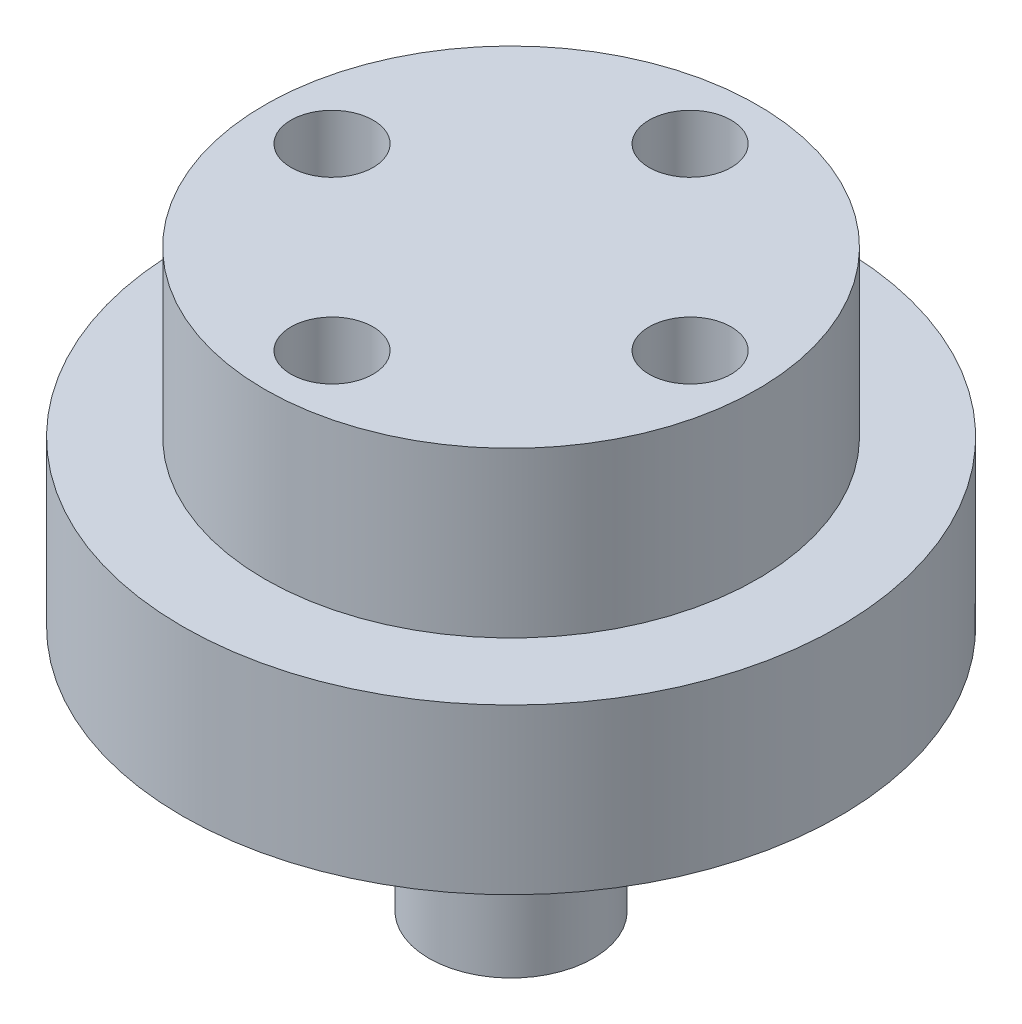
ISO-10303-21;
HEADER;
FILE_DESCRIPTION(('STEP AP214'),'2;1');
FILE_NAME('part.step','',(''),(''),'','','');
FILE_SCHEMA(('AUTOMOTIVE_DESIGN { 1 0 10303 214 1 1 1 1 }'));
ENDSEC;
DATA;
#1=APPLICATION_CONTEXT('core data for automotive mechanical design processes');
#2=APPLICATION_PROTOCOL_DEFINITION('international standard','automotive_design',2000,#1);
#3=PRODUCT_CONTEXT('',#1,'mechanical');
#4=PRODUCT('Part','Part','',(#3));
#5=PRODUCT_RELATED_PRODUCT_CATEGORY('part','',(#4));
#6=PRODUCT_DEFINITION_FORMATION('','',#4);
#7=PRODUCT_DEFINITION_CONTEXT('part definition',#1,'design');
#8=PRODUCT_DEFINITION('design','',#6,#7);
#9=PRODUCT_DEFINITION_SHAPE('','',#8);
#10=(LENGTH_UNIT() NAMED_UNIT(*) SI_UNIT(.MILLI.,.METRE.));
#11=(NAMED_UNIT(*) PLANE_ANGLE_UNIT() SI_UNIT($,.RADIAN.));
#12=(NAMED_UNIT(*) SI_UNIT($,.STERADIAN.) SOLID_ANGLE_UNIT());
#13=UNCERTAINTY_MEASURE_WITH_UNIT(LENGTH_MEASURE(1.E-05),#10,'distance_accuracy_value','');
#14=(GEOMETRIC_REPRESENTATION_CONTEXT(3) GLOBAL_UNCERTAINTY_ASSIGNED_CONTEXT((#13)) GLOBAL_UNIT_ASSIGNED_CONTEXT((#10,
#11,#12)) REPRESENTATION_CONTEXT('',''));
#15=CARTESIAN_POINT('',(0.,0.,0.));
#16=DIRECTION('',(0.,0.,1.));
#17=DIRECTION('',(1.,0.,0.));
#18=AXIS2_PLACEMENT_3D('',#15,#16,#17);
#19=CARTESIAN_POINT('',(0.,50.8,0.));
#20=DIRECTION('',(0.,-1.,0.));
#21=DIRECTION('',(0.,0.,-1.));
#22=AXIS2_PLACEMENT_3D('',#19,#20,#21);
#23=CYLINDRICAL_SURFACE('',#22,101.6);
#24=CARTESIAN_POINT('',(0.,50.8,0.));
#25=DIRECTION('',(0.,1.,0.));
#26=DIRECTION('',(0.,0.,1.));
#27=AXIS2_PLACEMENT_3D('',#24,#25,#26);
#28=CIRCLE('',#27,101.6);
#29=CARTESIAN_POINT('',(0.,50.8,101.6));
#30=VERTEX_POINT('',#29);
#31=EDGE_CURVE('E36',#30,#30,#28,.T.);
#32=ORIENTED_EDGE('',*,*,#31,.F.);
#33=EDGE_LOOP('',(#32));
#34=FACE_BOUND('',#33,.T.);
#35=CARTESIAN_POINT('',(0.,0.,0.));
#36=DIRECTION('',(0.,1.,0.));
#37=DIRECTION('',(0.,0.,1.));
#38=AXIS2_PLACEMENT_3D('',#35,#36,#37);
#39=CIRCLE('',#38,101.6);
#40=CARTESIAN_POINT('',(0.,0.,101.6));
#41=VERTEX_POINT('',#40);
#42=EDGE_CURVE('E40',#41,#41,#39,.T.);
#43=ORIENTED_EDGE('',*,*,#42,.T.);
#44=EDGE_LOOP('',(#43));
#45=FACE_BOUND('',#44,.T.);
#46=ADVANCED_FACE('F30',(#34,#45),#23,.T.);
#47=CARTESIAN_POINT('',(0.,50.8,0.));
#48=DIRECTION('',(0.,1.,0.));
#49=DIRECTION('',(0.,0.,1.));
#50=AXIS2_PLACEMENT_3D('',#47,#48,#49);
#51=PLANE('',#50);
#52=CARTESIAN_POINT('',(0.,50.8,0.));
#53=DIRECTION('',(0.,1.,0.));
#54=DIRECTION('',(0.,0.,1.));
#55=AXIS2_PLACEMENT_3D('',#52,#53,#54);
#56=CIRCLE('',#55,76.2);
#57=CARTESIAN_POINT('',(0.,50.8,76.2));
#58=VERTEX_POINT('',#57);
#59=EDGE_CURVE('E47',#58,#58,#56,.T.);
#60=ORIENTED_EDGE('',*,*,#59,.F.);
#61=EDGE_LOOP('',(#60));
#62=FACE_BOUND('',#61,.T.);
#63=ORIENTED_EDGE('',*,*,#31,.T.);
#64=EDGE_LOOP('',(#63));
#65=FACE_BOUND('',#64,.T.);
#66=ADVANCED_FACE('F95',(#62,#65),#51,.T.);
#67=CARTESIAN_POINT('',(0.,0.,0.));
#68=DIRECTION('',(0.,1.,0.));
#69=DIRECTION('',(0.,0.,1.));
#70=AXIS2_PLACEMENT_3D('',#67,#68,#69);
#71=PLANE('',#70);
#72=CARTESIAN_POINT('',(0.,0.,0.));
#73=DIRECTION('',(0.,1.,0.));
#74=DIRECTION('',(0.,0.,1.));
#75=AXIS2_PLACEMENT_3D('',#72,#73,#74);
#76=CIRCLE('',#75,25.4);
#77=CARTESIAN_POINT('',(0.,0.,25.4));
#78=VERTEX_POINT('',#77);
#79=EDGE_CURVE('E10',#78,#78,#76,.F.);
#80=ORIENTED_EDGE('',*,*,#79,.F.);
#81=EDGE_LOOP('',(#80));
#82=FACE_BOUND('',#81,.T.);
#83=CARTESIAN_POINT('',(55.372,0.,0.));
#84=DIRECTION('',(0.,1.,0.));
#85=DIRECTION('',(0.,0.,1.));
#86=AXIS2_PLACEMENT_3D('',#83,#84,#85);
#87=CIRCLE('',#86,12.7);
#88=CARTESIAN_POINT('',(55.372,0.,12.7));
#89=VERTEX_POINT('',#88);
#90=EDGE_CURVE('E68',#89,#89,#87,.T.);
#91=ORIENTED_EDGE('',*,*,#90,.T.);
#92=EDGE_LOOP('',(#91));
#93=FACE_BOUND('',#92,.T.);
#94=CARTESIAN_POINT('',(0.,0.,55.372));
#95=DIRECTION('',(0.,1.,0.));
#96=DIRECTION('',(0.,0.,1.));
#97=AXIS2_PLACEMENT_3D('',#94,#95,#96);
#98=CIRCLE('',#97,12.7);
#99=CARTESIAN_POINT('',(0.,0.,68.072));
#100=VERTEX_POINT('',#99);
#101=EDGE_CURVE('E62',#100,#100,#98,.T.);
#102=ORIENTED_EDGE('',*,*,#101,.T.);
#103=EDGE_LOOP('',(#102));
#104=FACE_BOUND('',#103,.T.);
#105=CARTESIAN_POINT('',(-55.372,0.,0.));
#106=DIRECTION('',(0.,1.,0.));
#107=DIRECTION('',(0.,0.,1.));
#108=AXIS2_PLACEMENT_3D('',#105,#106,#107);
#109=CIRCLE('',#108,12.7);
#110=CARTESIAN_POINT('',(-55.372,0.,12.7));
#111=VERTEX_POINT('',#110);
#112=EDGE_CURVE('E56',#111,#111,#109,.T.);
#113=ORIENTED_EDGE('',*,*,#112,.T.);
#114=EDGE_LOOP('',(#113));
#115=FACE_BOUND('',#114,.T.);
#116=CARTESIAN_POINT('',(0.,0.,-55.372));
#117=DIRECTION('',(0.,1.,0.));
#118=DIRECTION('',(0.,0.,1.));
#119=AXIS2_PLACEMENT_3D('',#116,#117,#118);
#120=CIRCLE('',#119,12.7);
#121=CARTESIAN_POINT('',(0.,0.,-42.672));
#122=VERTEX_POINT('',#121);
#123=EDGE_CURVE('E50',#122,#122,#120,.T.);
#124=ORIENTED_EDGE('',*,*,#123,.T.);
#125=EDGE_LOOP('',(#124));
#126=FACE_BOUND('',#125,.T.);
#127=ORIENTED_EDGE('',*,*,#42,.F.);
#128=EDGE_LOOP('',(#127));
#129=FACE_BOUND('',#128,.T.);
#130=ADVANCED_FACE('F100',(#82,#93,#104,#115,#126,#129),#71,.F.);
#131=CARTESIAN_POINT('',(0.,101.6,0.));
#132=DIRECTION('',(0.,-1.,0.));
#133=DIRECTION('',(0.,0.,-1.));
#134=AXIS2_PLACEMENT_3D('',#131,#132,#133);
#135=CYLINDRICAL_SURFACE('',#134,76.2);
#136=CARTESIAN_POINT('',(0.,101.6,0.));
#137=DIRECTION('',(0.,1.,0.));
#138=DIRECTION('',(0.,0.,1.));
#139=AXIS2_PLACEMENT_3D('',#136,#137,#138);
#140=CIRCLE('',#139,76.2);
#141=CARTESIAN_POINT('',(0.,101.6,76.2));
#142=VERTEX_POINT('',#141);
#143=EDGE_CURVE('E45',#142,#142,#140,.T.);
#144=ORIENTED_EDGE('',*,*,#143,.F.);
#145=EDGE_LOOP('',(#144));
#146=FACE_BOUND('',#145,.T.);
#147=ORIENTED_EDGE('',*,*,#59,.T.);
#148=EDGE_LOOP('',(#147));
#149=FACE_BOUND('',#148,.T.);
#150=ADVANCED_FACE('F107',(#146,#149),#135,.T.);
#151=CARTESIAN_POINT('',(0.,101.6,0.));
#152=DIRECTION('',(0.,1.,0.));
#153=DIRECTION('',(0.,0.,1.));
#154=AXIS2_PLACEMENT_3D('',#151,#152,#153);
#155=PLANE('',#154);
#156=CARTESIAN_POINT('',(55.372,101.6,0.));
#157=DIRECTION('',(0.,1.,0.));
#158=DIRECTION('',(0.,0.,1.));
#159=AXIS2_PLACEMENT_3D('',#156,#157,#158);
#160=CIRCLE('',#159,12.7);
#161=CARTESIAN_POINT('',(55.372,101.6,12.7));
#162=VERTEX_POINT('',#161);
#163=EDGE_CURVE('E71',#162,#162,#160,.T.);
#164=ORIENTED_EDGE('',*,*,#163,.F.);
#165=EDGE_LOOP('',(#164));
#166=FACE_BOUND('',#165,.T.);
#167=CARTESIAN_POINT('',(0.,101.6,55.372));
#168=DIRECTION('',(0.,1.,0.));
#169=DIRECTION('',(0.,0.,1.));
#170=AXIS2_PLACEMENT_3D('',#167,#168,#169);
#171=CIRCLE('',#170,12.7);
#172=CARTESIAN_POINT('',(0.,101.6,68.072));
#173=VERTEX_POINT('',#172);
#174=EDGE_CURVE('E65',#173,#173,#171,.T.);
#175=ORIENTED_EDGE('',*,*,#174,.F.);
#176=EDGE_LOOP('',(#175));
#177=FACE_BOUND('',#176,.T.);
#178=CARTESIAN_POINT('',(-55.372,101.6,0.));
#179=DIRECTION('',(0.,1.,0.));
#180=DIRECTION('',(0.,0.,1.));
#181=AXIS2_PLACEMENT_3D('',#178,#179,#180);
#182=CIRCLE('',#181,12.7);
#183=CARTESIAN_POINT('',(-55.372,101.6,12.7));
#184=VERTEX_POINT('',#183);
#185=EDGE_CURVE('E59',#184,#184,#182,.T.);
#186=ORIENTED_EDGE('',*,*,#185,.F.);
#187=EDGE_LOOP('',(#186));
#188=FACE_BOUND('',#187,.T.);
#189=CARTESIAN_POINT('',(0.,101.6,-55.372));
#190=DIRECTION('',(0.,1.,0.));
#191=DIRECTION('',(0.,0.,1.));
#192=AXIS2_PLACEMENT_3D('',#189,#190,#191);
#193=CIRCLE('',#192,12.7);
#194=CARTESIAN_POINT('',(0.,101.6,-42.672));
#195=VERTEX_POINT('',#194);
#196=EDGE_CURVE('E53',#195,#195,#193,.T.);
#197=ORIENTED_EDGE('',*,*,#196,.F.);
#198=EDGE_LOOP('',(#197));
#199=FACE_BOUND('',#198,.T.);
#200=ORIENTED_EDGE('',*,*,#143,.T.);
#201=EDGE_LOOP('',(#200));
#202=FACE_BOUND('',#201,.T.);
#203=ADVANCED_FACE('F112',(#166,#177,#188,#199,#202),#155,.T.);
#204=CARTESIAN_POINT('',(0.,0.,-55.372));
#205=DIRECTION('',(0.,1.,0.));
#206=DIRECTION('',(0.,0.,1.));
#207=AXIS2_PLACEMENT_3D('',#204,#205,#206);
#208=CYLINDRICAL_SURFACE('',#207,12.7);
#209=ORIENTED_EDGE('',*,*,#123,.F.);
#210=EDGE_LOOP('',(#209));
#211=FACE_BOUND('',#210,.T.);
#212=ORIENTED_EDGE('',*,*,#196,.T.);
#213=EDGE_LOOP('',(#212));
#214=FACE_BOUND('',#213,.T.);
#215=ADVANCED_FACE('F119',(#211,#214),#208,.F.);
#216=CARTESIAN_POINT('',(-55.372,0.,0.));
#217=DIRECTION('',(0.,1.,0.));
#218=DIRECTION('',(0.,0.,1.));
#219=AXIS2_PLACEMENT_3D('',#216,#217,#218);
#220=CYLINDRICAL_SURFACE('',#219,12.7);
#221=ORIENTED_EDGE('',*,*,#112,.F.);
#222=EDGE_LOOP('',(#221));
#223=FACE_BOUND('',#222,.T.);
#224=ORIENTED_EDGE('',*,*,#185,.T.);
#225=EDGE_LOOP('',(#224));
#226=FACE_BOUND('',#225,.T.);
#227=ADVANCED_FACE('F123',(#223,#226),#220,.F.);
#228=CARTESIAN_POINT('',(0.,0.,55.372));
#229=DIRECTION('',(0.,1.,0.));
#230=DIRECTION('',(0.,0.,1.));
#231=AXIS2_PLACEMENT_3D('',#228,#229,#230);
#232=CYLINDRICAL_SURFACE('',#231,12.7);
#233=ORIENTED_EDGE('',*,*,#101,.F.);
#234=EDGE_LOOP('',(#233));
#235=FACE_BOUND('',#234,.T.);
#236=ORIENTED_EDGE('',*,*,#174,.T.);
#237=EDGE_LOOP('',(#236));
#238=FACE_BOUND('',#237,.T.);
#239=ADVANCED_FACE('F91',(#235,#238),#232,.F.);
#240=CARTESIAN_POINT('',(55.372,0.,0.));
#241=DIRECTION('',(0.,1.,0.));
#242=DIRECTION('',(0.,0.,1.));
#243=AXIS2_PLACEMENT_3D('',#240,#241,#242);
#244=CYLINDRICAL_SURFACE('',#243,12.7);
#245=ORIENTED_EDGE('',*,*,#90,.F.);
#246=EDGE_LOOP('',(#245));
#247=FACE_BOUND('',#246,.T.);
#248=ORIENTED_EDGE('',*,*,#163,.T.);
#249=EDGE_LOOP('',(#248));
#250=FACE_BOUND('',#249,.T.);
#251=ADVANCED_FACE('F84',(#247,#250),#244,.F.);
#252=CARTESIAN_POINT('',(0.,-76.2,0.));
#253=DIRECTION('',(0.,1.,0.));
#254=DIRECTION('',(0.,0.,1.));
#255=AXIS2_PLACEMENT_3D('',#252,#253,#254);
#256=CYLINDRICAL_SURFACE('',#255,25.4);
#257=CARTESIAN_POINT('',(0.,-76.2,0.));
#258=DIRECTION('',(0.,-1.,0.));
#259=DIRECTION('',(0.,0.,-1.));
#260=AXIS2_PLACEMENT_3D('',#257,#258,#259);
#261=CIRCLE('',#260,25.4);
#262=CARTESIAN_POINT('',(0.,-76.2,25.4));
#263=VERTEX_POINT('',#262);
#264=EDGE_CURVE('E74',#263,#263,#261,.T.);
#265=CARTESIAN_POINT('',(0.,-76.2,25.4));
#266=CARTESIAN_POINT('',(0.,-75.40625,25.4));
#267=CARTESIAN_POINT('',(0.,-74.6125,25.4));
#268=CARTESIAN_POINT('',(0.,-73.025,25.4));
#269=CARTESIAN_POINT('',(0.,-72.23125,25.4));
#270=CARTESIAN_POINT('',(0.,-70.64375,25.4));
#271=CARTESIAN_POINT('',(0.,-69.85,25.4));
#272=CARTESIAN_POINT('',(0.,-68.2625,25.4));
#273=CARTESIAN_POINT('',(0.,-67.46875,25.4));
#274=CARTESIAN_POINT('',(0.,-65.88125,25.4));
#275=CARTESIAN_POINT('',(0.,-65.0875,25.4));
#276=CARTESIAN_POINT('',(0.,-63.5,25.4));
#277=CARTESIAN_POINT('',(0.,-62.70625,25.4));
#278=CARTESIAN_POINT('',(0.,-61.11875,25.4));
#279=CARTESIAN_POINT('',(0.,-60.325,25.4));
#280=CARTESIAN_POINT('',(0.,-58.7375,25.4));
#281=CARTESIAN_POINT('',(0.,-57.94375,25.4));
#282=CARTESIAN_POINT('',(0.,-56.35625,25.4));
#283=CARTESIAN_POINT('',(0.,-55.5625,25.4));
#284=CARTESIAN_POINT('',(0.,-53.975,25.4));
#285=CARTESIAN_POINT('',(0.,-53.18125,25.4));
#286=CARTESIAN_POINT('',(0.,-51.59375,25.4));
#287=CARTESIAN_POINT('',(0.,-50.8,25.4));
#288=CARTESIAN_POINT('',(0.,-49.2125,25.4));
#289=CARTESIAN_POINT('',(0.,-48.41875,25.4));
#290=CARTESIAN_POINT('',(0.,-46.83125,25.4));
#291=CARTESIAN_POINT('',(0.,-46.0375,25.4));
#292=CARTESIAN_POINT('',(0.,-44.45,25.4));
#293=CARTESIAN_POINT('',(0.,-43.65625,25.4));
#294=CARTESIAN_POINT('',(0.,-42.06875,25.4));
#295=CARTESIAN_POINT('',(0.,-41.275,25.4));
#296=CARTESIAN_POINT('',(0.,-39.6875,25.4));
#297=CARTESIAN_POINT('',(0.,-38.89375,25.4));
#298=CARTESIAN_POINT('',(0.,-37.30625,25.4));
#299=CARTESIAN_POINT('',(0.,-36.5125,25.4));
#300=CARTESIAN_POINT('',(0.,-34.925,25.4));
#301=CARTESIAN_POINT('',(0.,-34.13125,25.4));
#302=CARTESIAN_POINT('',(0.,-32.54375,25.4));
#303=CARTESIAN_POINT('',(0.,-31.75,25.4));
#304=CARTESIAN_POINT('',(0.,-30.1625,25.4));
#305=CARTESIAN_POINT('',(0.,-29.36875,25.4));
#306=CARTESIAN_POINT('',(0.,-27.78125,25.4));
#307=CARTESIAN_POINT('',(0.,-26.9875,25.4));
#308=CARTESIAN_POINT('',(0.,-25.4,25.4));
#309=CARTESIAN_POINT('',(0.,-24.60625,25.4));
#310=CARTESIAN_POINT('',(0.,-23.01875,25.4));
#311=CARTESIAN_POINT('',(0.,-22.225,25.4));
#312=CARTESIAN_POINT('',(0.,-20.6375,25.4));
#313=CARTESIAN_POINT('',(0.,-19.84375,25.4));
#314=CARTESIAN_POINT('',(0.,-18.25625,25.4));
#315=CARTESIAN_POINT('',(0.,-17.4625,25.4));
#316=CARTESIAN_POINT('',(0.,-15.875,25.4));
#317=CARTESIAN_POINT('',(0.,-15.08125,25.4));
#318=CARTESIAN_POINT('',(0.,-13.49375,25.4));
#319=CARTESIAN_POINT('',(0.,-12.7,25.4));
#320=CARTESIAN_POINT('',(0.,-11.1125,25.4));
#321=CARTESIAN_POINT('',(0.,-10.31875,25.4));
#322=CARTESIAN_POINT('',(0.,-8.73125,25.4));
#323=CARTESIAN_POINT('',(0.,-7.93750000000001,25.4));
#324=CARTESIAN_POINT('',(0.,-6.35,25.4));
#325=CARTESIAN_POINT('',(0.,-5.55625,25.4));
#326=CARTESIAN_POINT('',(0.,-3.96875,25.4));
#327=CARTESIAN_POINT('',(0.,-3.175,25.4));
#328=CARTESIAN_POINT('',(0.,-1.5875,25.4));
#329=CARTESIAN_POINT('',(0.,-0.793750000000001,25.4));
#330=CARTESIAN_POINT('',(0.,0.,25.4));
#331=B_SPLINE_CURVE_WITH_KNOTS('',3,(#265,#266,#267,#268,#269,#270,#271,#272,#273,#274,#275,
#276,#277,#278,#279,#280,#281,#282,#283,#284,#285,#286,#287,#288,#289,#290,#291,#292,#293,#294,
#295,#296,#297,#298,#299,#300,#301,#302,#303,#304,#305,#306,#307,#308,#309,#310,#311,#312,#313,
#314,#315,#316,#317,#318,#319,#320,#321,#322,#323,#324,#325,#326,#327,#328,#329,#330),
.UNSPECIFIED.,.F.,.F.,(4,2,2,2,2,2,2,2,2,2,2,2,2,2,2,2,2,2,2,2,2,2,2,2,2,2,2,2,2,2,2,2,4),(0.,
2.38125,4.7625,7.14375,9.52500000000001,11.90625,14.2875,16.66875,19.05,21.43125,23.8125,
26.19375,28.575,30.95625,33.3375,35.71875,38.1,40.48125,42.8625,45.24375,47.625,50.00625,
52.3875,54.76875,57.15,59.53125,61.9125,64.29375,66.675,69.05625,71.4375,73.81875,76.2),.UNSPECIFIED.);
#332=EDGE_CURVE('BSEAM82',#263,#78,#331,.T.);
#333=ORIENTED_EDGE('',*,*,#264,.F.);
#334=ORIENTED_EDGE('',*,*,#79,.T.);
#335=ORIENTED_EDGE('',*,*,#332,.T.);
#336=ORIENTED_EDGE('',*,*,#332,.F.);
#337=EDGE_LOOP('',(#333,#335,#334,#336));
#338=FACE_BOUND('',#337,.T.);
#339=ADVANCED_FACE('F82',(#338),#256,.T.);
#340=CARTESIAN_POINT('',(0.,-76.2,0.));
#341=DIRECTION('',(0.,-1.,0.));
#342=DIRECTION('',(0.,0.,-1.));
#343=AXIS2_PLACEMENT_3D('',#340,#341,#342);
#344=PLANE('',#343);
#345=ORIENTED_EDGE('',*,*,#264,.T.);
#346=EDGE_LOOP('',(#345));
#347=FACE_BOUND('',#346,.T.);
#348=ADVANCED_FACE('F80',(#347),#344,.T.);
#349=CLOSED_SHELL('',(#46,#66,#130,#150,#203,#215,#227,#239,#251,#339,#348));
#350=MANIFOLD_SOLID_BREP('B2',#349);
#351=ADVANCED_BREP_SHAPE_REPRESENTATION('',(#18,#350),#14);
#352=SHAPE_DEFINITION_REPRESENTATION(#9,#351);
ENDSEC;
END-ISO-10303-21;
